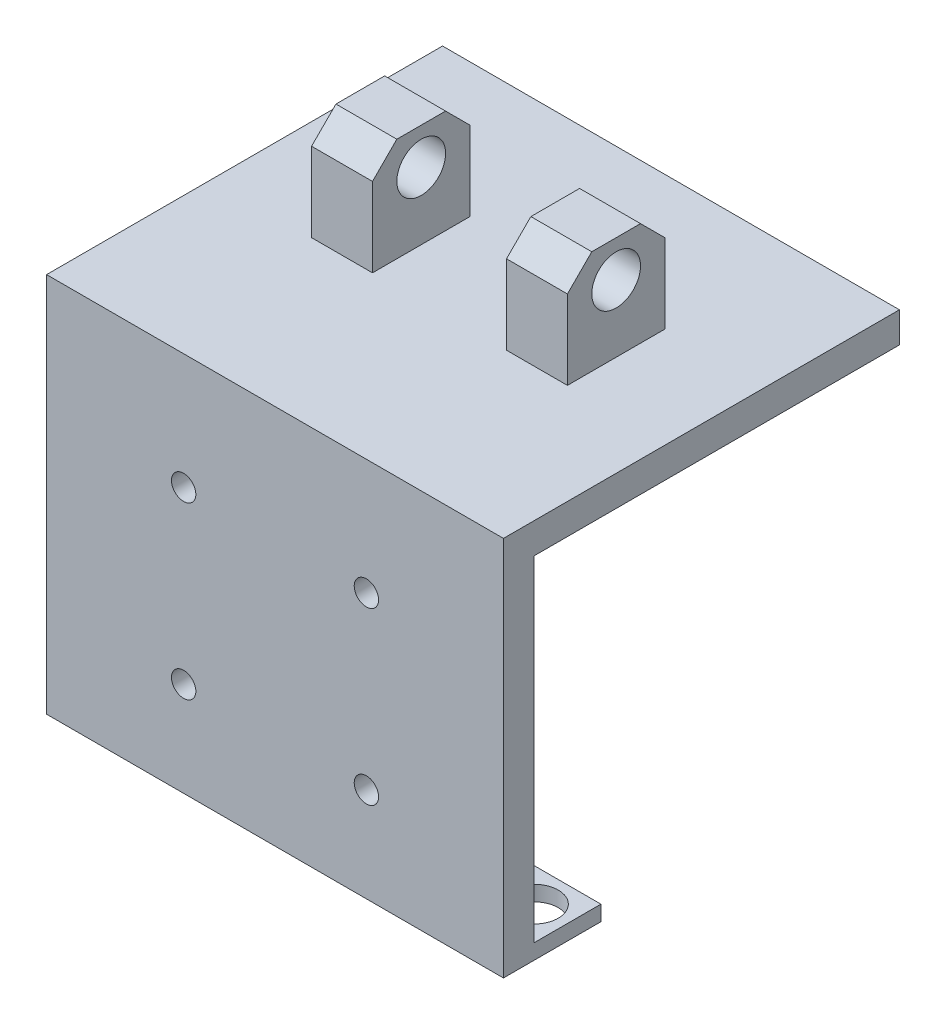
ISO-10303-21;
HEADER;
FILE_DESCRIPTION(('STEP AP214'),'2;1');
FILE_NAME('part.step','',(''),(''),'','','');
FILE_SCHEMA(('AUTOMOTIVE_DESIGN { 1 0 10303 214 1 1 1 1 }'));
ENDSEC;
DATA;
#1=APPLICATION_CONTEXT('core data for automotive mechanical design processes');
#2=APPLICATION_PROTOCOL_DEFINITION('international standard','automotive_design',2000,#1);
#3=PRODUCT_CONTEXT('',#1,'mechanical');
#4=PRODUCT('Part','Part','',(#3));
#5=PRODUCT_RELATED_PRODUCT_CATEGORY('part','',(#4));
#6=PRODUCT_DEFINITION_FORMATION('','',#4);
#7=PRODUCT_DEFINITION_CONTEXT('part definition',#1,'design');
#8=PRODUCT_DEFINITION('design','',#6,#7);
#9=PRODUCT_DEFINITION_SHAPE('','',#8);
#10=(LENGTH_UNIT() NAMED_UNIT(*) SI_UNIT(.MILLI.,.METRE.));
#11=(NAMED_UNIT(*) PLANE_ANGLE_UNIT() SI_UNIT($,.RADIAN.));
#12=(NAMED_UNIT(*) SI_UNIT($,.STERADIAN.) SOLID_ANGLE_UNIT());
#13=UNCERTAINTY_MEASURE_WITH_UNIT(LENGTH_MEASURE(1.E-05),#10,'distance_accuracy_value','');
#14=(GEOMETRIC_REPRESENTATION_CONTEXT(3) GLOBAL_UNCERTAINTY_ASSIGNED_CONTEXT((#13)) GLOBAL_UNIT_ASSIGNED_CONTEXT((#10,
#11,#12)) REPRESENTATION_CONTEXT('',''));
#15=CARTESIAN_POINT('',(0.,0.,0.));
#16=DIRECTION('',(0.,0.,1.));
#17=DIRECTION('',(1.,0.,0.));
#18=AXIS2_PLACEMENT_3D('',#15,#16,#17);
#19=CARTESIAN_POINT('',(-12.6888412017167,60.,1.56680469030455));
#20=DIRECTION('',(0.,0.,1.));
#21=DIRECTION('',(1.,0.,0.));
#22=AXIS2_PLACEMENT_3D('',#19,#20,#21);
#23=PLANE('',#22);
#24=CARTESIAN_POINT('',(9.81115879828327,13.,1.56680469030454));
#25=DIRECTION('',(0.,0.,-1.));
#26=DIRECTION('',(-1.,0.,0.));
#27=AXIS2_PLACEMENT_3D('',#24,#25,#26);
#28=CIRCLE('',#27,2.);
#29=CARTESIAN_POINT('',(7.81115879828327,13.,1.56680469030454));
#30=VERTEX_POINT('',#29);
#31=EDGE_CURVE('E273',#30,#30,#28,.T.);
#32=ORIENTED_EDGE('',*,*,#31,.F.);
#33=EDGE_LOOP('',(#32));
#34=FACE_BOUND('',#33,.T.);
#35=CARTESIAN_POINT('',(39.8111587982833,13.,1.56680469030454));
#36=DIRECTION('',(0.,0.,-1.));
#37=DIRECTION('',(-1.,0.,0.));
#38=AXIS2_PLACEMENT_3D('',#35,#36,#37);
#39=CIRCLE('',#38,2.);
#40=CARTESIAN_POINT('',(37.8111587982833,13.,1.56680469030454));
#41=VERTEX_POINT('',#40);
#42=EDGE_CURVE('E268',#41,#41,#39,.T.);
#43=ORIENTED_EDGE('',*,*,#42,.F.);
#44=EDGE_LOOP('',(#43));
#45=FACE_BOUND('',#44,.T.);
#46=CARTESIAN_POINT('',(39.8111587982833,41.,1.56680469030454));
#47=DIRECTION('',(0.,0.,-1.));
#48=DIRECTION('',(-1.,0.,0.));
#49=AXIS2_PLACEMENT_3D('',#46,#47,#48);
#50=CIRCLE('',#49,2.);
#51=CARTESIAN_POINT('',(37.8111587982833,41.,1.56680469030454));
#52=VERTEX_POINT('',#51);
#53=EDGE_CURVE('E262',#52,#52,#50,.T.);
#54=ORIENTED_EDGE('',*,*,#53,.F.);
#55=EDGE_LOOP('',(#54));
#56=FACE_BOUND('',#55,.T.);
#57=CARTESIAN_POINT('',(9.81115879828327,41.,1.56680469030454));
#58=DIRECTION('',(0.,0.,-1.));
#59=DIRECTION('',(-1.,0.,0.));
#60=AXIS2_PLACEMENT_3D('',#57,#58,#59);
#61=CIRCLE('',#60,2.);
#62=CARTESIAN_POINT('',(7.81115879828327,41.,1.56680469030454));
#63=VERTEX_POINT('',#62);
#64=EDGE_CURVE('E255',#63,#63,#61,.T.);
#65=ORIENTED_EDGE('',*,*,#64,.F.);
#66=EDGE_LOOP('',(#65));
#67=FACE_BOUND('',#66,.T.);
#68=DIRECTION('',(-1.,0.,0.));
#69=VECTOR('',#68,1.);
#70=CARTESIAN_POINT('',(-12.6888412017167,55.,1.56680469030455));
#71=LINE('',#70,#69);
#72=CARTESIAN_POINT('',(62.3111587982833,55.,1.56680469030453));
#73=VERTEX_POINT('',#72);
#74=CARTESIAN_POINT('',(-12.6888412017167,55.,1.56680469030455));
#75=VERTEX_POINT('',#74);
#76=EDGE_CURVE('E237',#73,#75,#71,.T.);
#77=ORIENTED_EDGE('',*,*,#76,.F.);
#78=DIRECTION('',(0.,-1.,0.));
#79=VECTOR('',#78,1.);
#80=CARTESIAN_POINT('',(62.3111587982833,60.,1.56680469030453));
#81=LINE('',#80,#79);
#82=CARTESIAN_POINT('',(62.3111587982833,0.,1.56680469030454));
#83=VERTEX_POINT('',#82);
#84=EDGE_CURVE('E291',#73,#83,#81,.T.);
#85=ORIENTED_EDGE('',*,*,#84,.T.);
#86=DIRECTION('',(-1.,0.,0.));
#87=VECTOR('',#86,1.);
#88=CARTESIAN_POINT('',(-12.6888412017167,0.,1.56680469030455));
#89=LINE('',#88,#87);
#90=CARTESIAN_POINT('',(-12.6888412017167,0.,1.56680469030455));
#91=VERTEX_POINT('',#90);
#92=EDGE_CURVE('E276',#83,#91,#89,.T.);
#93=ORIENTED_EDGE('',*,*,#92,.T.);
#94=DIRECTION('',(0.,-1.,0.));
#95=VECTOR('',#94,1.);
#96=CARTESIAN_POINT('',(-12.6888412017167,60.,1.56680469030455));
#97=LINE('',#96,#95);
#98=EDGE_CURVE('E287',#75,#91,#97,.T.);
#99=ORIENTED_EDGE('',*,*,#98,.F.);
#100=EDGE_LOOP('',(#77,#85,#93,#99));
#101=FACE_BOUND('',#100,.T.);
#102=ADVANCED_FACE('F35',(#34,#45,#56,#67,#101),#23,.F.);
#103=CARTESIAN_POINT('',(-12.6888412017167,-2.5,-9.43319530969545));
#104=DIRECTION('',(-1.,0.,0.));
#105=DIRECTION('',(0.,0.,1.));
#106=AXIS2_PLACEMENT_3D('',#103,#104,#105);
#107=PLANE('',#106);
#108=DIRECTION('',(0.,0.,1.));
#109=VECTOR('',#108,1.);
#110=CARTESIAN_POINT('',(-12.6888412017167,0.,-9.43319530969545));
#111=LINE('',#110,#109);
#112=CARTESIAN_POINT('',(-12.6888412017167,0.,-9.43319530969545));
#113=VERTEX_POINT('',#112);
#114=EDGE_CURVE('E303',#113,#91,#111,.T.);
#115=ORIENTED_EDGE('',*,*,#114,.F.);
#116=DIRECTION('',(0.,1.,0.));
#117=VECTOR('',#116,1.);
#118=CARTESIAN_POINT('',(-12.6888412017167,-2.5,-9.43319530969545));
#119=LINE('',#118,#117);
#120=CARTESIAN_POINT('',(-12.6888412017167,-2.5,-9.43319530969545));
#121=VERTEX_POINT('',#120);
#122=EDGE_CURVE('E326',#121,#113,#119,.T.);
#123=ORIENTED_EDGE('',*,*,#122,.F.);
#124=DIRECTION('',(0.,0.,1.));
#125=VECTOR('',#124,1.);
#126=CARTESIAN_POINT('',(-12.6888412017167,-2.5,-9.43319530969545));
#127=LINE('',#126,#125);
#128=CARTESIAN_POINT('',(-12.6888412017167,-2.5,6.56680469030455));
#129=VERTEX_POINT('',#128);
#130=EDGE_CURVE('E306',#121,#129,#127,.T.);
#131=ORIENTED_EDGE('',*,*,#130,.T.);
#132=DIRECTION('',(0.,1.,0.));
#133=VECTOR('',#132,1.);
#134=CARTESIAN_POINT('',(-12.6888412017167,-2.5,6.56680469030455));
#135=LINE('',#134,#133);
#136=CARTESIAN_POINT('',(-12.6888412017167,60.,6.56680469030455));
#137=VERTEX_POINT('',#136);
#138=EDGE_CURVE('E319',#129,#137,#135,.T.);
#139=ORIENTED_EDGE('',*,*,#138,.T.);
#140=DIRECTION('',(0.,0.,1.));
#141=VECTOR('',#140,1.);
#142=CARTESIAN_POINT('',(-12.6888412017167,60.,1.56680469030455));
#143=LINE('',#142,#141);
#144=CARTESIAN_POINT('',(-12.6888412017167,60.,-58.4331953096954));
#145=VERTEX_POINT('',#144);
#146=EDGE_CURVE('E279',#145,#137,#143,.T.);
#147=ORIENTED_EDGE('',*,*,#146,.F.);
#148=DIRECTION('',(0.,1.,0.));
#149=VECTOR('',#148,1.);
#150=CARTESIAN_POINT('',(-12.6888412017167,55.,-58.4331953096954));
#151=LINE('',#150,#149);
#152=CARTESIAN_POINT('',(-12.6888412017167,55.,-58.4331953096954));
#153=VERTEX_POINT('',#152);
#154=EDGE_CURVE('E238',#153,#145,#151,.T.);
#155=ORIENTED_EDGE('',*,*,#154,.F.);
#156=DIRECTION('',(0.,0.,1.));
#157=VECTOR('',#156,1.);
#158=CARTESIAN_POINT('',(-12.6888412017167,55.,-58.4331953096954));
#159=LINE('',#158,#157);
#160=EDGE_CURVE('E248',#153,#75,#159,.T.);
#161=ORIENTED_EDGE('',*,*,#160,.T.);
#162=ORIENTED_EDGE('',*,*,#98,.T.);
#163=EDGE_LOOP('',(#115,#123,#131,#139,#147,#155,#161,#162));
#164=FACE_BOUND('',#163,.T.);
#165=ADVANCED_FACE('F398',(#164),#107,.T.);
#166=CARTESIAN_POINT('',(-12.6888412017167,-2.5,-9.43319530969545));
#167=DIRECTION('',(0.,0.,-1.));
#168=DIRECTION('',(-1.,0.,0.));
#169=AXIS2_PLACEMENT_3D('',#166,#167,#168);
#170=PLANE('',#169);
#171=DIRECTION('',(-1.,0.,0.));
#172=VECTOR('',#171,1.);
#173=CARTESIAN_POINT('',(-12.6888412017167,0.,-9.43319530969545));
#174=LINE('',#173,#172);
#175=CARTESIAN_POINT('',(62.3111587982833,0.,-9.43319530969547));
#176=VERTEX_POINT('',#175);
#177=EDGE_CURVE('E310',#176,#113,#174,.T.);
#178=ORIENTED_EDGE('',*,*,#177,.F.);
#179=DIRECTION('',(0.,1.,0.));
#180=VECTOR('',#179,1.);
#181=CARTESIAN_POINT('',(62.3111587982833,-2.5,-9.43319530969547));
#182=LINE('',#181,#180);
#183=CARTESIAN_POINT('',(62.3111587982833,-2.5,-9.43319530969547));
#184=VERTEX_POINT('',#183);
#185=EDGE_CURVE('E329',#184,#176,#182,.T.);
#186=ORIENTED_EDGE('',*,*,#185,.F.);
#187=DIRECTION('',(-1.,0.,0.));
#188=VECTOR('',#187,1.);
#189=CARTESIAN_POINT('',(-12.6888412017167,-2.5,-9.43319530969545));
#190=LINE('',#189,#188);
#191=EDGE_CURVE('E316',#184,#121,#190,.T.);
#192=ORIENTED_EDGE('',*,*,#191,.T.);
#193=ORIENTED_EDGE('',*,*,#122,.T.);
#194=EDGE_LOOP('',(#178,#186,#192,#193));
#195=FACE_BOUND('',#194,.T.);
#196=ADVANCED_FACE('F404',(#195),#170,.T.);
#197=CARTESIAN_POINT('',(62.3111587982833,-2.5,-9.43319530969547));
#198=DIRECTION('',(1.,0.,0.));
#199=DIRECTION('',(0.,0.,-1.));
#200=AXIS2_PLACEMENT_3D('',#197,#198,#199);
#201=PLANE('',#200);
#202=DIRECTION('',(0.,0.,-1.));
#203=VECTOR('',#202,1.);
#204=CARTESIAN_POINT('',(62.3111587982833,0.,-9.43319530969547));
#205=LINE('',#204,#203);
#206=EDGE_CURVE('E322',#83,#176,#205,.T.);
#207=ORIENTED_EDGE('',*,*,#206,.F.);
#208=ORIENTED_EDGE('',*,*,#84,.F.);
#209=DIRECTION('',(0.,0.,1.));
#210=VECTOR('',#209,1.);
#211=CARTESIAN_POINT('',(62.3111587982833,55.,-58.4331953096955));
#212=LINE('',#211,#210);
#213=CARTESIAN_POINT('',(62.3111587982833,55.,-58.4331953096955));
#214=VERTEX_POINT('',#213);
#215=EDGE_CURVE('E252',#214,#73,#212,.T.);
#216=ORIENTED_EDGE('',*,*,#215,.F.);
#217=DIRECTION('',(0.,-1.,0.));
#218=VECTOR('',#217,1.);
#219=CARTESIAN_POINT('',(62.3111587982833,55.,-58.4331953096955));
#220=LINE('',#219,#218);
#221=CARTESIAN_POINT('',(62.3111587982833,60.,-58.4331953096955));
#222=VERTEX_POINT('',#221);
#223=EDGE_CURVE('E244',#222,#214,#220,.T.);
#224=ORIENTED_EDGE('',*,*,#223,.F.);
#225=DIRECTION('',(0.,0.,-1.));
#226=VECTOR('',#225,1.);
#227=CARTESIAN_POINT('',(62.3111587982833,60.,1.56680469030453));
#228=LINE('',#227,#226);
#229=CARTESIAN_POINT('',(62.3111587982833,60.,6.56680469030453));
#230=VERTEX_POINT('',#229);
#231=EDGE_CURVE('E285',#230,#222,#228,.T.);
#232=ORIENTED_EDGE('',*,*,#231,.F.);
#233=DIRECTION('',(0.,1.,0.));
#234=VECTOR('',#233,1.);
#235=CARTESIAN_POINT('',(62.3111587982833,-2.5,6.56680469030455));
#236=LINE('',#235,#234);
#237=CARTESIAN_POINT('',(62.3111587982833,-2.5,6.56680469030455));
#238=VERTEX_POINT('',#237);
#239=EDGE_CURVE('E332',#238,#230,#236,.T.);
#240=ORIENTED_EDGE('',*,*,#239,.F.);
#241=DIRECTION('',(0.,0.,-1.));
#242=VECTOR('',#241,1.);
#243=CARTESIAN_POINT('',(62.3111587982833,-2.5,-9.43319530969547));
#244=LINE('',#243,#242);
#245=EDGE_CURVE('E313',#238,#184,#244,.T.);
#246=ORIENTED_EDGE('',*,*,#245,.T.);
#247=ORIENTED_EDGE('',*,*,#185,.T.);
#248=EDGE_LOOP('',(#207,#208,#216,#224,#232,#240,#246,#247));
#249=FACE_BOUND('',#248,.T.);
#250=ADVANCED_FACE('F431',(#249),#201,.T.);
#251=CARTESIAN_POINT('',(-12.6888412017167,-2.5,6.56680469030455));
#252=DIRECTION('',(0.,0.,1.));
#253=DIRECTION('',(1.,0.,0.));
#254=AXIS2_PLACEMENT_3D('',#251,#252,#253);
#255=PLANE('',#254);
#256=CARTESIAN_POINT('',(9.81115879828327,41.,6.56680469030455));
#257=DIRECTION('',(0.,0.,1.));
#258=DIRECTION('',(1.,0.,0.));
#259=AXIS2_PLACEMENT_3D('',#256,#257,#258);
#260=CIRCLE('',#259,2.);
#261=CARTESIAN_POINT('',(11.8111587982833,41.,6.56680469030455));
#262=VERTEX_POINT('',#261);
#263=EDGE_CURVE('E259',#262,#262,#260,.F.);
#264=ORIENTED_EDGE('',*,*,#263,.T.);
#265=EDGE_LOOP('',(#264));
#266=FACE_BOUND('',#265,.T.);
#267=CARTESIAN_POINT('',(39.8111587982833,41.,6.56680469030455));
#268=DIRECTION('',(0.,0.,1.));
#269=DIRECTION('',(1.,0.,0.));
#270=AXIS2_PLACEMENT_3D('',#267,#268,#269);
#271=CIRCLE('',#270,2.);
#272=CARTESIAN_POINT('',(41.8111587982833,41.,6.56680469030455));
#273=VERTEX_POINT('',#272);
#274=EDGE_CURVE('E265',#273,#273,#271,.F.);
#275=ORIENTED_EDGE('',*,*,#274,.T.);
#276=EDGE_LOOP('',(#275));
#277=FACE_BOUND('',#276,.T.);
#278=CARTESIAN_POINT('',(39.8111587982833,13.,6.56680469030455));
#279=DIRECTION('',(0.,0.,1.));
#280=DIRECTION('',(1.,0.,0.));
#281=AXIS2_PLACEMENT_3D('',#278,#279,#280);
#282=CIRCLE('',#281,2.);
#283=CARTESIAN_POINT('',(41.8111587982833,13.,6.56680469030455));
#284=VERTEX_POINT('',#283);
#285=EDGE_CURVE('E254',#284,#284,#282,.F.);
#286=ORIENTED_EDGE('',*,*,#285,.T.);
#287=EDGE_LOOP('',(#286));
#288=FACE_BOUND('',#287,.T.);
#289=CARTESIAN_POINT('',(9.81115879828327,13.,6.56680469030455));
#290=DIRECTION('',(0.,0.,1.));
#291=DIRECTION('',(1.,0.,0.));
#292=AXIS2_PLACEMENT_3D('',#289,#290,#291);
#293=CIRCLE('',#292,2.);
#294=CARTESIAN_POINT('',(11.8111587982833,13.,6.56680469030455));
#295=VERTEX_POINT('',#294);
#296=EDGE_CURVE('E258',#295,#295,#293,.F.);
#297=ORIENTED_EDGE('',*,*,#296,.T.);
#298=EDGE_LOOP('',(#297));
#299=FACE_BOUND('',#298,.T.);
#300=ORIENTED_EDGE('',*,*,#239,.T.);
#301=DIRECTION('',(1.,0.,0.));
#302=VECTOR('',#301,1.);
#303=CARTESIAN_POINT('',(-12.6888412017167,60.,6.56680469030455));
#304=LINE('',#303,#302);
#305=EDGE_CURVE('E282',#137,#230,#304,.T.);
#306=ORIENTED_EDGE('',*,*,#305,.F.);
#307=ORIENTED_EDGE('',*,*,#138,.F.);
#308=DIRECTION('',(1.,0.,0.));
#309=VECTOR('',#308,1.);
#310=CARTESIAN_POINT('',(-12.6888412017167,-2.5,6.56680469030455));
#311=LINE('',#310,#309);
#312=EDGE_CURVE('E309',#129,#238,#311,.T.);
#313=ORIENTED_EDGE('',*,*,#312,.T.);
#314=EDGE_LOOP('',(#300,#306,#307,#313));
#315=FACE_BOUND('',#314,.T.);
#316=ADVANCED_FACE('F424',(#266,#277,#288,#299,#315),#255,.T.);
#317=CARTESIAN_POINT('',(0.,-2.5,0.));
#318=DIRECTION('',(0.,1.,0.));
#319=DIRECTION('',(0.,0.,1.));
#320=AXIS2_PLACEMENT_3D('',#317,#318,#319);
#321=PLANE('',#320);
#322=CARTESIAN_POINT('',(56.8111587982833,-2.5,-3.93319530969547));
#323=DIRECTION('',(0.,1.,0.));
#324=DIRECTION('',(0.,0.,1.));
#325=AXIS2_PLACEMENT_3D('',#322,#323,#324);
#326=CIRCLE('',#325,4.);
#327=CARTESIAN_POINT('',(56.8111587982833,-2.5,0.0668046903045298));
#328=VERTEX_POINT('',#327);
#329=EDGE_CURVE('E294',#328,#328,#326,.T.);
#330=ORIENTED_EDGE('',*,*,#329,.T.);
#331=EDGE_LOOP('',(#330));
#332=FACE_BOUND('',#331,.T.);
#333=CARTESIAN_POINT('',(-7.18884120171673,-2.5,-3.93319530969546));
#334=DIRECTION('',(0.,1.,0.));
#335=DIRECTION('',(0.,0.,1.));
#336=AXIS2_PLACEMENT_3D('',#333,#334,#335);
#337=CIRCLE('',#336,4.);
#338=CARTESIAN_POINT('',(-7.18884120171673,-2.5,0.0668046903045437));
#339=VERTEX_POINT('',#338);
#340=EDGE_CURVE('E300',#339,#339,#337,.T.);
#341=ORIENTED_EDGE('',*,*,#340,.T.);
#342=EDGE_LOOP('',(#341));
#343=FACE_BOUND('',#342,.T.);
#344=ORIENTED_EDGE('',*,*,#130,.F.);
#345=ORIENTED_EDGE('',*,*,#191,.F.);
#346=ORIENTED_EDGE('',*,*,#245,.F.);
#347=ORIENTED_EDGE('',*,*,#312,.F.);
#348=EDGE_LOOP('',(#344,#345,#346,#347));
#349=FACE_BOUND('',#348,.T.);
#350=ADVANCED_FACE('F421',(#332,#343,#349),#321,.F.);
#351=CARTESIAN_POINT('',(0.,0.,0.));
#352=DIRECTION('',(0.,1.,0.));
#353=DIRECTION('',(0.,0.,1.));
#354=AXIS2_PLACEMENT_3D('',#351,#352,#353);
#355=PLANE('',#354);
#356=ORIENTED_EDGE('',*,*,#92,.F.);
#357=ORIENTED_EDGE('',*,*,#206,.T.);
#358=ORIENTED_EDGE('',*,*,#177,.T.);
#359=ORIENTED_EDGE('',*,*,#114,.T.);
#360=EDGE_LOOP('',(#356,#357,#358,#359));
#361=FACE_BOUND('',#360,.T.);
#362=CARTESIAN_POINT('',(56.8111587982833,0.,-3.93319530969547));
#363=DIRECTION('',(0.,1.,0.));
#364=DIRECTION('',(0.,0.,1.));
#365=AXIS2_PLACEMENT_3D('',#362,#363,#364);
#366=CIRCLE('',#365,4.);
#367=CARTESIAN_POINT('',(56.8111587982833,0.,0.0668046903045298));
#368=VERTEX_POINT('',#367);
#369=EDGE_CURVE('E293',#368,#368,#366,.T.);
#370=ORIENTED_EDGE('',*,*,#369,.F.);
#371=EDGE_LOOP('',(#370));
#372=FACE_BOUND('',#371,.T.);
#373=CARTESIAN_POINT('',(-7.18884120171673,0.,-3.93319530969546));
#374=DIRECTION('',(0.,1.,0.));
#375=DIRECTION('',(0.,0.,1.));
#376=AXIS2_PLACEMENT_3D('',#373,#374,#375);
#377=CIRCLE('',#376,4.);
#378=CARTESIAN_POINT('',(-7.18884120171673,0.,0.0668046903045437));
#379=VERTEX_POINT('',#378);
#380=EDGE_CURVE('E297',#379,#379,#377,.T.);
#381=ORIENTED_EDGE('',*,*,#380,.F.);
#382=EDGE_LOOP('',(#381));
#383=FACE_BOUND('',#382,.T.);
#384=ADVANCED_FACE('F419',(#361,#372,#383),#355,.T.);
#385=CARTESIAN_POINT('',(-7.18884120171673,-2.5,-3.93319530969546));
#386=DIRECTION('',(0.,1.,0.));
#387=DIRECTION('',(0.,0.,1.));
#388=AXIS2_PLACEMENT_3D('',#385,#386,#387);
#389=CYLINDRICAL_SURFACE('',#388,4.);
#390=ORIENTED_EDGE('',*,*,#340,.F.);
#391=EDGE_LOOP('',(#390));
#392=FACE_BOUND('',#391,.T.);
#393=ORIENTED_EDGE('',*,*,#380,.T.);
#394=EDGE_LOOP('',(#393));
#395=FACE_BOUND('',#394,.T.);
#396=ADVANCED_FACE('F415',(#392,#395),#389,.F.);
#397=CARTESIAN_POINT('',(56.8111587982833,-2.5,-3.93319530969547));
#398=DIRECTION('',(0.,1.,0.));
#399=DIRECTION('',(0.,0.,1.));
#400=AXIS2_PLACEMENT_3D('',#397,#398,#399);
#401=CYLINDRICAL_SURFACE('',#400,4.);
#402=ORIENTED_EDGE('',*,*,#329,.F.);
#403=EDGE_LOOP('',(#402));
#404=FACE_BOUND('',#403,.T.);
#405=ORIENTED_EDGE('',*,*,#369,.T.);
#406=EDGE_LOOP('',(#405));
#407=FACE_BOUND('',#406,.T.);
#408=ADVANCED_FACE('F412',(#404,#407),#401,.F.);
#409=CARTESIAN_POINT('',(0.,60.,0.));
#410=DIRECTION('',(0.,1.,0.));
#411=DIRECTION('',(0.,0.,1.));
#412=AXIS2_PLACEMENT_3D('',#409,#410,#411);
#413=PLANE('',#412);
#414=DIRECTION('',(0.,0.,-1.));
#415=VECTOR('',#414,1.);
#416=CARTESIAN_POINT('',(13.8111587982833,60.,0.));
#417=LINE('',#416,#415);
#418=CARTESIAN_POINT('',(13.8111587982833,60.,-20.4331953096954));
#419=VERTEX_POINT('',#418);
#420=CARTESIAN_POINT('',(13.8111587982833,60.,-36.4331953096954));
#421=VERTEX_POINT('',#420);
#422=EDGE_CURVE('E180',#419,#421,#417,.T.);
#423=ORIENTED_EDGE('',*,*,#422,.F.);
#424=DIRECTION('',(1.,0.,0.));
#425=VECTOR('',#424,1.);
#426=CARTESIAN_POINT('',(0.,60.,-20.4331953096954));
#427=LINE('',#426,#425);
#428=CARTESIAN_POINT('',(3.81115879828327,60.,-20.4331953096954));
#429=VERTEX_POINT('',#428);
#430=EDGE_CURVE('E196',#429,#419,#427,.T.);
#431=ORIENTED_EDGE('',*,*,#430,.F.);
#432=DIRECTION('',(0.,0.,1.));
#433=VECTOR('',#432,1.);
#434=CARTESIAN_POINT('',(3.81115879828327,60.,0.));
#435=LINE('',#434,#433);
#436=CARTESIAN_POINT('',(3.81115879828328,60.,-36.4331953096954));
#437=VERTEX_POINT('',#436);
#438=EDGE_CURVE('E204',#437,#429,#435,.T.);
#439=ORIENTED_EDGE('',*,*,#438,.F.);
#440=DIRECTION('',(-1.,0.,0.));
#441=VECTOR('',#440,1.);
#442=CARTESIAN_POINT('',(0.,60.,-36.4331953096954));
#443=LINE('',#442,#441);
#444=EDGE_CURVE('E199',#421,#437,#443,.T.);
#445=ORIENTED_EDGE('',*,*,#444,.F.);
#446=EDGE_LOOP('',(#423,#431,#439,#445));
#447=FACE_BOUND('',#446,.T.);
#448=DIRECTION('',(1.,0.,0.));
#449=VECTOR('',#448,1.);
#450=CARTESIAN_POINT('',(0.,60.,-20.4331953096955));
#451=LINE('',#450,#449);
#452=CARTESIAN_POINT('',(35.8111587982833,60.,-20.4331953096954));
#453=VERTEX_POINT('',#452);
#454=CARTESIAN_POINT('',(45.8111587982833,60.,-20.4331953096954));
#455=VERTEX_POINT('',#454);
#456=EDGE_CURVE('E234',#453,#455,#451,.T.);
#457=ORIENTED_EDGE('',*,*,#456,.F.);
#458=DIRECTION('',(0.,0.,1.));
#459=VECTOR('',#458,1.);
#460=CARTESIAN_POINT('',(35.8111587982833,60.,0.));
#461=LINE('',#460,#459);
#462=CARTESIAN_POINT('',(35.8111587982833,60.,-36.4331953096954));
#463=VERTEX_POINT('',#462);
#464=EDGE_CURVE('E220',#463,#453,#461,.T.);
#465=ORIENTED_EDGE('',*,*,#464,.F.);
#466=DIRECTION('',(-1.,0.,0.));
#467=VECTOR('',#466,1.);
#468=CARTESIAN_POINT('',(0.,60.,-36.4331953096954));
#469=LINE('',#468,#467);
#470=CARTESIAN_POINT('',(45.8111587982833,60.,-36.4331953096954));
#471=VERTEX_POINT('',#470);
#472=EDGE_CURVE('E228',#471,#463,#469,.T.);
#473=ORIENTED_EDGE('',*,*,#472,.F.);
#474=DIRECTION('',(0.,0.,-1.));
#475=VECTOR('',#474,1.);
#476=CARTESIAN_POINT('',(45.8111587982833,60.,0.));
#477=LINE('',#476,#475);
#478=EDGE_CURVE('E231',#455,#471,#477,.T.);
#479=ORIENTED_EDGE('',*,*,#478,.F.);
#480=EDGE_LOOP('',(#457,#465,#473,#479));
#481=FACE_BOUND('',#480,.T.);
#482=ORIENTED_EDGE('',*,*,#146,.T.);
#483=ORIENTED_EDGE('',*,*,#305,.T.);
#484=ORIENTED_EDGE('',*,*,#231,.T.);
#485=DIRECTION('',(1.,0.,0.));
#486=VECTOR('',#485,1.);
#487=CARTESIAN_POINT('',(-12.6888412017167,60.,-58.4331953096954));
#488=LINE('',#487,#486);
#489=EDGE_CURVE('E241',#145,#222,#488,.T.);
#490=ORIENTED_EDGE('',*,*,#489,.F.);
#491=EDGE_LOOP('',(#482,#483,#484,#490));
#492=FACE_BOUND('',#491,.T.);
#493=ADVANCED_FACE('F193',(#447,#481,#492),#413,.T.);
#494=CARTESIAN_POINT('',(9.81115879828327,13.,6.56780469030456));
#495=DIRECTION('',(0.,0.,-1.));
#496=DIRECTION('',(-1.,0.,0.));
#497=AXIS2_PLACEMENT_3D('',#494,#495,#496);
#498=CYLINDRICAL_SURFACE('',#497,2.);
#499=ORIENTED_EDGE('',*,*,#296,.F.);
#500=EDGE_LOOP('',(#499));
#501=FACE_BOUND('',#500,.T.);
#502=ORIENTED_EDGE('',*,*,#31,.T.);
#503=EDGE_LOOP('',(#502));
#504=FACE_BOUND('',#503,.T.);
#505=ADVANCED_FACE('F492',(#501,#504),#498,.F.);
#506=CARTESIAN_POINT('',(39.8111587982833,13.,6.56780469030455));
#507=DIRECTION('',(0.,0.,-1.));
#508=DIRECTION('',(-1.,0.,0.));
#509=AXIS2_PLACEMENT_3D('',#506,#507,#508);
#510=CYLINDRICAL_SURFACE('',#509,2.);
#511=ORIENTED_EDGE('',*,*,#285,.F.);
#512=EDGE_LOOP('',(#511));
#513=FACE_BOUND('',#512,.T.);
#514=ORIENTED_EDGE('',*,*,#42,.T.);
#515=EDGE_LOOP('',(#514));
#516=FACE_BOUND('',#515,.T.);
#517=ADVANCED_FACE('F489',(#513,#516),#510,.F.);
#518=CARTESIAN_POINT('',(39.8111587982833,41.,6.56780469030455));
#519=DIRECTION('',(0.,0.,-1.));
#520=DIRECTION('',(-1.,0.,0.));
#521=AXIS2_PLACEMENT_3D('',#518,#519,#520);
#522=CYLINDRICAL_SURFACE('',#521,2.);
#523=ORIENTED_EDGE('',*,*,#274,.F.);
#524=EDGE_LOOP('',(#523));
#525=FACE_BOUND('',#524,.T.);
#526=ORIENTED_EDGE('',*,*,#53,.T.);
#527=EDGE_LOOP('',(#526));
#528=FACE_BOUND('',#527,.T.);
#529=ADVANCED_FACE('F482',(#525,#528),#522,.F.);
#530=CARTESIAN_POINT('',(9.81115879828327,41.,6.56780469030456));
#531=DIRECTION('',(0.,0.,-1.));
#532=DIRECTION('',(-1.,0.,0.));
#533=AXIS2_PLACEMENT_3D('',#530,#531,#532);
#534=CYLINDRICAL_SURFACE('',#533,2.);
#535=ORIENTED_EDGE('',*,*,#263,.F.);
#536=EDGE_LOOP('',(#535));
#537=FACE_BOUND('',#536,.T.);
#538=ORIENTED_EDGE('',*,*,#64,.T.);
#539=EDGE_LOOP('',(#538));
#540=FACE_BOUND('',#539,.T.);
#541=ADVANCED_FACE('F475',(#537,#540),#534,.F.);
#542=CARTESIAN_POINT('',(-12.6888412017167,55.,-58.4331953096954));
#543=DIRECTION('',(0.,1.,0.));
#544=DIRECTION('',(-1.,0.,0.));
#545=AXIS2_PLACEMENT_3D('',#542,#543,#544);
#546=PLANE('',#545);
#547=ORIENTED_EDGE('',*,*,#76,.T.);
#548=ORIENTED_EDGE('',*,*,#160,.F.);
#549=DIRECTION('',(-1.,0.,0.));
#550=VECTOR('',#549,1.);
#551=CARTESIAN_POINT('',(-12.6888412017167,55.,-58.4331953096954));
#552=LINE('',#551,#550);
#553=EDGE_CURVE('E246',#214,#153,#552,.T.);
#554=ORIENTED_EDGE('',*,*,#553,.F.);
#555=ORIENTED_EDGE('',*,*,#215,.T.);
#556=EDGE_LOOP('',(#547,#548,#554,#555));
#557=FACE_BOUND('',#556,.T.);
#558=ADVANCED_FACE('F473',(#557),#546,.F.);
#559=CARTESIAN_POINT('',(0.,0.,-58.4331953096955));
#560=DIRECTION('',(0.,0.,-1.));
#561=DIRECTION('',(-1.,0.,0.));
#562=AXIS2_PLACEMENT_3D('',#559,#560,#561);
#563=PLANE('',#562);
#564=ORIENTED_EDGE('',*,*,#154,.T.);
#565=ORIENTED_EDGE('',*,*,#489,.T.);
#566=ORIENTED_EDGE('',*,*,#223,.T.);
#567=ORIENTED_EDGE('',*,*,#553,.T.);
#568=EDGE_LOOP('',(#564,#565,#566,#567));
#569=FACE_BOUND('',#568,.T.);
#570=ADVANCED_FACE('F459',(#569),#563,.T.);
#571=CARTESIAN_POINT('',(35.8111587982833,77.,-20.4331953096954));
#572=DIRECTION('',(0.,0.,1.));
#573=DIRECTION('',(1.,0.,0.));
#574=AXIS2_PLACEMENT_3D('',#571,#572,#573);
#575=PLANE('',#574);
#576=DIRECTION('',(0.,-1.,0.));
#577=VECTOR('',#576,1.);
#578=CARTESIAN_POINT('',(45.8111587982833,77.,-20.4331953096954));
#579=LINE('',#578,#577);
#580=CARTESIAN_POINT('',(45.8111587982833,73.,-20.4331953096954));
#581=VERTEX_POINT('',#580);
#582=EDGE_CURVE('E218',#581,#455,#579,.T.);
#583=ORIENTED_EDGE('',*,*,#582,.F.);
#584=DIRECTION('',(-1.,0.,0.));
#585=VECTOR('',#584,1.);
#586=CARTESIAN_POINT('',(35.8111587982833,73.,-20.4331953096954));
#587=LINE('',#586,#585);
#588=CARTESIAN_POINT('',(35.8111587982833,73.,-20.4331953096954));
#589=VERTEX_POINT('',#588);
#590=EDGE_CURVE('E351',#581,#589,#587,.T.);
#591=ORIENTED_EDGE('',*,*,#590,.T.);
#592=DIRECTION('',(0.,-1.,0.));
#593=VECTOR('',#592,1.);
#594=CARTESIAN_POINT('',(35.8111587982833,77.,-20.4331953096954));
#595=LINE('',#594,#593);
#596=EDGE_CURVE('E217',#589,#453,#595,.T.);
#597=ORIENTED_EDGE('',*,*,#596,.T.);
#598=ORIENTED_EDGE('',*,*,#456,.T.);
#599=EDGE_LOOP('',(#583,#591,#597,#598));
#600=FACE_BOUND('',#599,.T.);
#601=ADVANCED_FACE('F377',(#600),#575,.T.);
#602=CARTESIAN_POINT('',(45.8111587982833,77.,-20.4331953096954));
#603=DIRECTION('',(1.,0.,0.));
#604=DIRECTION('',(0.,0.,-1.));
#605=AXIS2_PLACEMENT_3D('',#602,#603,#604);
#606=PLANE('',#605);
#607=CARTESIAN_POINT('',(45.8111587982833,71.,-28.4331953096954));
#608=DIRECTION('',(1.,0.,0.));
#609=DIRECTION('',(0.,0.,-1.));
#610=AXIS2_PLACEMENT_3D('',#607,#608,#609);
#611=CIRCLE('',#610,4.00000000000001);
#612=CARTESIAN_POINT('',(45.8111587982833,71.,-32.4331953096954));
#613=VERTEX_POINT('',#612);
#614=EDGE_CURVE('E667',#613,#613,#611,.T.);
#615=ORIENTED_EDGE('',*,*,#614,.F.);
#616=EDGE_LOOP('',(#615));
#617=FACE_BOUND('',#616,.T.);
#618=DIRECTION('',(0.,0.,1.));
#619=VECTOR('',#618,1.);
#620=CARTESIAN_POINT('',(45.8111587982833,77.,-20.4331953096954));
#621=LINE('',#620,#619);
#622=CARTESIAN_POINT('',(45.8111587982833,77.,-32.4331953096954));
#623=VERTEX_POINT('',#622);
#624=CARTESIAN_POINT('',(45.8111587982833,77.,-24.4331953096954));
#625=VERTEX_POINT('',#624);
#626=EDGE_CURVE('E215',#623,#625,#621,.T.);
#627=ORIENTED_EDGE('',*,*,#626,.T.);
#628=DIRECTION('',(0.,0.707106781186548,-0.707106781186547));
#629=VECTOR('',#628,1.);
#630=CARTESIAN_POINT('',(45.8111587982833,75.,-22.4331953096954));
#631=LINE('',#630,#629);
#632=EDGE_CURVE('E362',#625,#581,#631,.F.);
#633=ORIENTED_EDGE('',*,*,#632,.T.);
#634=ORIENTED_EDGE('',*,*,#582,.T.);
#635=ORIENTED_EDGE('',*,*,#478,.T.);
#636=DIRECTION('',(0.,-1.,0.));
#637=VECTOR('',#636,1.);
#638=CARTESIAN_POINT('',(45.8111587982833,77.,-36.4331953096954));
#639=LINE('',#638,#637);
#640=CARTESIAN_POINT('',(45.8111587982833,73.,-36.4331953096954));
#641=VERTEX_POINT('',#640);
#642=EDGE_CURVE('E221',#641,#471,#639,.T.);
#643=ORIENTED_EDGE('',*,*,#642,.F.);
#644=DIRECTION('',(0.,-0.707106781186546,-0.707106781186549));
#645=VECTOR('',#644,1.);
#646=CARTESIAN_POINT('',(45.8111587982833,83.,-26.4331953096954));
#647=LINE('',#646,#645);
#648=EDGE_CURVE('E50',#641,#623,#647,.F.);
#649=ORIENTED_EDGE('',*,*,#648,.T.);
#650=EDGE_LOOP('',(#627,#633,#634,#635,#643,#649));
#651=FACE_BOUND('',#650,.T.);
#652=ADVANCED_FACE('F370',(#617,#651),#606,.T.);
#653=CARTESIAN_POINT('',(45.8111587982833,77.,-36.4331953096954));
#654=DIRECTION('',(0.,0.,-1.));
#655=DIRECTION('',(0.,1.,0.));
#656=AXIS2_PLACEMENT_3D('',#653,#654,#655);
#657=PLANE('',#656);
#658=DIRECTION('',(0.,-1.,0.));
#659=VECTOR('',#658,1.);
#660=CARTESIAN_POINT('',(35.8111587982833,77.,-36.4331953096954));
#661=LINE('',#660,#659);
#662=CARTESIAN_POINT('',(35.8111587982833,73.,-36.4331953096954));
#663=VERTEX_POINT('',#662);
#664=EDGE_CURVE('E223',#663,#463,#661,.T.);
#665=ORIENTED_EDGE('',*,*,#664,.F.);
#666=DIRECTION('',(1.,0.,0.));
#667=VECTOR('',#666,1.);
#668=CARTESIAN_POINT('',(45.8111587982833,73.,-36.4331953096954));
#669=LINE('',#668,#667);
#670=EDGE_CURVE('E43',#663,#641,#669,.T.);
#671=ORIENTED_EDGE('',*,*,#670,.T.);
#672=ORIENTED_EDGE('',*,*,#642,.T.);
#673=ORIENTED_EDGE('',*,*,#472,.T.);
#674=EDGE_LOOP('',(#665,#671,#672,#673));
#675=FACE_BOUND('',#674,.T.);
#676=ADVANCED_FACE('F366',(#675),#657,.T.);
#677=CARTESIAN_POINT('',(35.8111587982833,77.,-20.4331953096954));
#678=DIRECTION('',(-1.,0.,0.));
#679=DIRECTION('',(0.,0.,1.));
#680=AXIS2_PLACEMENT_3D('',#677,#678,#679);
#681=PLANE('',#680);
#682=CARTESIAN_POINT('',(35.8111587982833,71.,-28.4331953096954));
#683=DIRECTION('',(-1.,0.,0.));
#684=DIRECTION('',(0.,0.,1.));
#685=AXIS2_PLACEMENT_3D('',#682,#683,#684);
#686=CIRCLE('',#685,4.00000000000001);
#687=CARTESIAN_POINT('',(35.8111587982833,71.,-24.4331953096954));
#688=VERTEX_POINT('',#687);
#689=EDGE_CURVE('E670',#688,#688,#686,.T.);
#690=ORIENTED_EDGE('',*,*,#689,.F.);
#691=EDGE_LOOP('',(#690));
#692=FACE_BOUND('',#691,.T.);
#693=ORIENTED_EDGE('',*,*,#596,.F.);
#694=DIRECTION('',(0.,-0.707106781186548,0.707106781186547));
#695=VECTOR('',#694,1.);
#696=CARTESIAN_POINT('',(35.8111587982833,75.,-22.4331953096954));
#697=LINE('',#696,#695);
#698=CARTESIAN_POINT('',(35.8111587982833,77.,-24.4331953096954));
#699=VERTEX_POINT('',#698);
#700=EDGE_CURVE('E356',#589,#699,#697,.F.);
#701=ORIENTED_EDGE('',*,*,#700,.T.);
#702=DIRECTION('',(0.,0.,-1.));
#703=VECTOR('',#702,1.);
#704=CARTESIAN_POINT('',(35.8111587982833,77.,-20.4331953096954));
#705=LINE('',#704,#703);
#706=CARTESIAN_POINT('',(35.8111587982833,77.,-32.4331953096954));
#707=VERTEX_POINT('',#706);
#708=EDGE_CURVE('E200',#699,#707,#705,.T.);
#709=ORIENTED_EDGE('',*,*,#708,.T.);
#710=DIRECTION('',(0.,0.707106781186546,0.707106781186549));
#711=VECTOR('',#710,1.);
#712=CARTESIAN_POINT('',(35.8111587982833,83.,-26.4331953096954));
#713=LINE('',#712,#711);
#714=EDGE_CURVE('E354',#707,#663,#713,.F.);
#715=ORIENTED_EDGE('',*,*,#714,.T.);
#716=ORIENTED_EDGE('',*,*,#664,.T.);
#717=ORIENTED_EDGE('',*,*,#464,.T.);
#718=EDGE_LOOP('',(#693,#701,#709,#715,#716,#717));
#719=FACE_BOUND('',#718,.T.);
#720=ADVANCED_FACE('F381',(#692,#719),#681,.T.);
#721=CARTESIAN_POINT('',(0.,77.,0.));
#722=DIRECTION('',(0.,1.,0.));
#723=DIRECTION('',(-1.,0.,0.));
#724=AXIS2_PLACEMENT_3D('',#721,#722,#723);
#725=PLANE('',#724);
#726=ORIENTED_EDGE('',*,*,#708,.F.);
#727=DIRECTION('',(1.,0.,0.));
#728=VECTOR('',#727,1.);
#729=CARTESIAN_POINT('',(0.,77.,-24.4331953096955));
#730=LINE('',#729,#728);
#731=EDGE_CURVE('E58',#699,#625,#730,.T.);
#732=ORIENTED_EDGE('',*,*,#731,.T.);
#733=ORIENTED_EDGE('',*,*,#626,.F.);
#734=DIRECTION('',(-1.,0.,0.));
#735=VECTOR('',#734,1.);
#736=CARTESIAN_POINT('',(0.,77.,-32.4331953096954));
#737=LINE('',#736,#735);
#738=EDGE_CURVE('E358',#623,#707,#737,.T.);
#739=ORIENTED_EDGE('',*,*,#738,.T.);
#740=EDGE_LOOP('',(#726,#732,#733,#739));
#741=FACE_BOUND('',#740,.T.);
#742=ADVANCED_FACE('F383',(#741),#725,.T.);
#743=CARTESIAN_POINT('',(13.8111587982833,77.,-20.4331953096954));
#744=DIRECTION('',(1.,0.,0.));
#745=DIRECTION('',(0.,0.,-1.));
#746=AXIS2_PLACEMENT_3D('',#743,#744,#745);
#747=PLANE('',#746);
#748=CARTESIAN_POINT('',(13.8111587982833,71.,-28.4331953096955));
#749=DIRECTION('',(1.,0.,0.));
#750=DIRECTION('',(0.,0.,-1.));
#751=AXIS2_PLACEMENT_3D('',#748,#749,#750);
#752=CIRCLE('',#751,4.00000000000001);
#753=CARTESIAN_POINT('',(13.8111587982833,71.,-32.4331953096955));
#754=VERTEX_POINT('',#753);
#755=EDGE_CURVE('E338',#754,#754,#752,.T.);
#756=ORIENTED_EDGE('',*,*,#755,.F.);
#757=EDGE_LOOP('',(#756));
#758=FACE_BOUND('',#757,.T.);
#759=DIRECTION('',(0.,0.,1.));
#760=VECTOR('',#759,1.);
#761=CARTESIAN_POINT('',(13.8111587982833,77.,-20.4331953096954));
#762=LINE('',#761,#760);
#763=CARTESIAN_POINT('',(13.8111587982833,77.,-32.4331953096954));
#764=VERTEX_POINT('',#763);
#765=CARTESIAN_POINT('',(13.8111587982833,77.,-24.4331953096955));
#766=VERTEX_POINT('',#765);
#767=EDGE_CURVE('E665',#764,#766,#762,.T.);
#768=ORIENTED_EDGE('',*,*,#767,.T.);
#769=DIRECTION('',(0.,0.707106781186547,-0.707106781186548));
#770=VECTOR('',#769,1.);
#771=CARTESIAN_POINT('',(13.8111587982833,75.,-22.4331953096955));
#772=LINE('',#771,#770);
#773=CARTESIAN_POINT('',(13.8111587982833,73.,-20.4331953096954));
#774=VERTEX_POINT('',#773);
#775=EDGE_CURVE('E182',#766,#774,#772,.F.);
#776=ORIENTED_EDGE('',*,*,#775,.T.);
#777=DIRECTION('',(0.,-1.,0.));
#778=VECTOR('',#777,1.);
#779=CARTESIAN_POINT('',(13.8111587982833,77.,-20.4331953096954));
#780=LINE('',#779,#778);
#781=EDGE_CURVE('E175',#774,#419,#780,.T.);
#782=ORIENTED_EDGE('',*,*,#781,.T.);
#783=ORIENTED_EDGE('',*,*,#422,.T.);
#784=DIRECTION('',(0.,-1.,0.));
#785=VECTOR('',#784,1.);
#786=CARTESIAN_POINT('',(13.8111587982833,77.,-36.4331953096954));
#787=LINE('',#786,#785);
#788=CARTESIAN_POINT('',(13.8111587982833,73.,-36.4331953096954));
#789=VERTEX_POINT('',#788);
#790=EDGE_CURVE('E205',#789,#421,#787,.T.);
#791=ORIENTED_EDGE('',*,*,#790,.F.);
#792=DIRECTION('',(0.,-0.707106781186545,-0.70710678118655));
#793=VECTOR('',#792,1.);
#794=CARTESIAN_POINT('',(13.8111587982833,83.,-26.4331953096954));
#795=LINE('',#794,#793);
#796=EDGE_CURVE('E348',#789,#764,#795,.F.);
#797=ORIENTED_EDGE('',*,*,#796,.T.);
#798=EDGE_LOOP('',(#768,#776,#782,#783,#791,#797));
#799=FACE_BOUND('',#798,.T.);
#800=ADVANCED_FACE('F178',(#758,#799),#747,.T.);
#801=CARTESIAN_POINT('',(13.8111587982833,77.,-36.4331953096954));
#802=DIRECTION('',(0.,0.,-1.));
#803=DIRECTION('',(0.,1.,0.));
#804=AXIS2_PLACEMENT_3D('',#801,#802,#803);
#805=PLANE('',#804);
#806=DIRECTION('',(0.,-1.,0.));
#807=VECTOR('',#806,1.);
#808=CARTESIAN_POINT('',(3.81115879828328,77.,-36.4331953096954));
#809=LINE('',#808,#807);
#810=CARTESIAN_POINT('',(3.81115879828328,73.,-36.4331953096954));
#811=VERTEX_POINT('',#810);
#812=EDGE_CURVE('E208',#811,#437,#809,.T.);
#813=ORIENTED_EDGE('',*,*,#812,.F.);
#814=DIRECTION('',(1.,0.,0.));
#815=VECTOR('',#814,1.);
#816=CARTESIAN_POINT('',(13.8111587982833,73.,-36.4331953096954));
#817=LINE('',#816,#815);
#818=EDGE_CURVE('E11',#811,#789,#817,.T.);
#819=ORIENTED_EDGE('',*,*,#818,.T.);
#820=ORIENTED_EDGE('',*,*,#790,.T.);
#821=ORIENTED_EDGE('',*,*,#444,.T.);
#822=EDGE_LOOP('',(#813,#819,#820,#821));
#823=FACE_BOUND('',#822,.T.);
#824=ADVANCED_FACE('F585',(#823),#805,.T.);
#825=CARTESIAN_POINT('',(3.81115879828328,77.,-20.4331953096954));
#826=DIRECTION('',(-1.,0.,0.));
#827=DIRECTION('',(0.,-1.,0.));
#828=AXIS2_PLACEMENT_3D('',#825,#826,#827);
#829=PLANE('',#828);
#830=CARTESIAN_POINT('',(3.81115879828329,71.,-28.4331953096955));
#831=DIRECTION('',(-1.,0.,0.));
#832=DIRECTION('',(0.,-1.,0.));
#833=AXIS2_PLACEMENT_3D('',#830,#831,#832);
#834=CIRCLE('',#833,4.00000000000001);
#835=CARTESIAN_POINT('',(3.81115879828328,67.,-28.4331953096955));
#836=VERTEX_POINT('',#835);
#837=EDGE_CURVE('E335',#836,#836,#834,.T.);
#838=ORIENTED_EDGE('',*,*,#837,.F.);
#839=EDGE_LOOP('',(#838));
#840=FACE_BOUND('',#839,.T.);
#841=DIRECTION('',(0.,-1.,0.));
#842=VECTOR('',#841,1.);
#843=CARTESIAN_POINT('',(3.81115879828328,77.,-20.4331953096954));
#844=LINE('',#843,#842);
#845=CARTESIAN_POINT('',(3.81115879828328,73.,-20.4331953096954));
#846=VERTEX_POINT('',#845);
#847=EDGE_CURVE('E187',#846,#429,#844,.T.);
#848=ORIENTED_EDGE('',*,*,#847,.F.);
#849=DIRECTION('',(0.,-0.707106781186547,0.707106781186548));
#850=VECTOR('',#849,1.);
#851=CARTESIAN_POINT('',(3.81115879828328,75.,-22.4331953096955));
#852=LINE('',#851,#850);
#853=CARTESIAN_POINT('',(3.81115879828328,77.,-24.4331953096955));
#854=VERTEX_POINT('',#853);
#855=EDGE_CURVE('E342',#846,#854,#852,.F.);
#856=ORIENTED_EDGE('',*,*,#855,.T.);
#857=DIRECTION('',(0.,0.,-1.));
#858=VECTOR('',#857,1.);
#859=CARTESIAN_POINT('',(3.81115879828328,77.,-20.4331953096954));
#860=LINE('',#859,#858);
#861=CARTESIAN_POINT('',(3.81115879828328,77.,-32.4331953096954));
#862=VERTEX_POINT('',#861);
#863=EDGE_CURVE('E188',#854,#862,#860,.T.);
#864=ORIENTED_EDGE('',*,*,#863,.T.);
#865=DIRECTION('',(0.,0.707106781186545,0.70710678118655));
#866=VECTOR('',#865,1.);
#867=CARTESIAN_POINT('',(3.81115879828328,83.,-26.4331953096954));
#868=LINE('',#867,#866);
#869=EDGE_CURVE('E340',#862,#811,#868,.F.);
#870=ORIENTED_EDGE('',*,*,#869,.T.);
#871=ORIENTED_EDGE('',*,*,#812,.T.);
#872=ORIENTED_EDGE('',*,*,#438,.T.);
#873=EDGE_LOOP('',(#848,#856,#864,#870,#871,#872));
#874=FACE_BOUND('',#873,.T.);
#875=ADVANCED_FACE('F593',(#840,#874),#829,.T.);
#876=CARTESIAN_POINT('',(13.8111587982833,77.,-20.4331953096954));
#877=DIRECTION('',(0.,0.,1.));
#878=DIRECTION('',(1.,0.,0.));
#879=AXIS2_PLACEMENT_3D('',#876,#877,#878);
#880=PLANE('',#879);
#881=ORIENTED_EDGE('',*,*,#781,.F.);
#882=DIRECTION('',(-1.,0.,0.));
#883=VECTOR('',#882,1.);
#884=CARTESIAN_POINT('',(13.8111587982833,73.,-20.4331953096954));
#885=LINE('',#884,#883);
#886=EDGE_CURVE('E328',#774,#846,#885,.T.);
#887=ORIENTED_EDGE('',*,*,#886,.T.);
#888=ORIENTED_EDGE('',*,*,#847,.T.);
#889=ORIENTED_EDGE('',*,*,#430,.T.);
#890=EDGE_LOOP('',(#881,#887,#888,#889));
#891=FACE_BOUND('',#890,.T.);
#892=ADVANCED_FACE('F202',(#891),#880,.T.);
#893=CARTESIAN_POINT('',(0.,77.,0.));
#894=DIRECTION('',(0.,1.,0.));
#895=DIRECTION('',(-1.,0.,0.));
#896=AXIS2_PLACEMENT_3D('',#893,#894,#895);
#897=PLANE('',#896);
#898=ORIENTED_EDGE('',*,*,#863,.F.);
#899=DIRECTION('',(1.,0.,0.));
#900=VECTOR('',#899,1.);
#901=CARTESIAN_POINT('',(0.,77.,-24.4331953096955));
#902=LINE('',#901,#900);
#903=EDGE_CURVE('E346',#854,#766,#902,.T.);
#904=ORIENTED_EDGE('',*,*,#903,.T.);
#905=ORIENTED_EDGE('',*,*,#767,.F.);
#906=DIRECTION('',(-1.,0.,0.));
#907=VECTOR('',#906,1.);
#908=CARTESIAN_POINT('',(0.,77.,-32.4331953096954));
#909=LINE('',#908,#907);
#910=EDGE_CURVE('E344',#764,#862,#909,.T.);
#911=ORIENTED_EDGE('',*,*,#910,.T.);
#912=EDGE_LOOP('',(#898,#904,#905,#911));
#913=FACE_BOUND('',#912,.T.);
#914=ADVANCED_FACE('F608',(#913),#897,.T.);
#915=CARTESIAN_POINT('',(-12.6888412017168,71.,-28.4331953096955));
#916=DIRECTION('',(1.,0.,0.));
#917=DIRECTION('',(0.,0.,-1.));
#918=AXIS2_PLACEMENT_3D('',#915,#916,#917);
#919=CYLINDRICAL_SURFACE('',#918,4.00000000000001);
#920=ORIENTED_EDGE('',*,*,#755,.T.);
#921=EDGE_LOOP('',(#920));
#922=FACE_BOUND('',#921,.T.);
#923=ORIENTED_EDGE('',*,*,#837,.T.);
#924=EDGE_LOOP('',(#923));
#925=FACE_BOUND('',#924,.T.);
#926=ADVANCED_FACE('F615',(#922,#925),#919,.F.);
#927=ORIENTED_EDGE('',*,*,#614,.T.);
#928=EDGE_LOOP('',(#927));
#929=FACE_BOUND('',#928,.T.);
#930=ORIENTED_EDGE('',*,*,#689,.T.);
#931=EDGE_LOOP('',(#930));
#932=FACE_BOUND('',#931,.T.);
#933=ADVANCED_FACE('F394',(#929,#932),#919,.F.);
#934=CARTESIAN_POINT('',(13.8111587982833,73.,-20.4331953096954));
#935=DIRECTION('',(0.,-0.707106781186548,-0.707106781186547));
#936=DIRECTION('',(-1.,0.,0.));
#937=AXIS2_PLACEMENT_3D('',#934,#935,#936);
#938=PLANE('',#937);
#939=ORIENTED_EDGE('',*,*,#775,.F.);
#940=ORIENTED_EDGE('',*,*,#903,.F.);
#941=ORIENTED_EDGE('',*,*,#855,.F.);
#942=ORIENTED_EDGE('',*,*,#886,.F.);
#943=EDGE_LOOP('',(#939,#940,#941,#942));
#944=FACE_BOUND('',#943,.T.);
#945=ADVANCED_FACE('F388',(#944),#938,.F.);
#946=CARTESIAN_POINT('',(35.8111587982833,73.,-20.4331953096954));
#947=DIRECTION('',(0.,-0.707106781186547,-0.707106781186548));
#948=DIRECTION('',(-1.,0.,0.));
#949=AXIS2_PLACEMENT_3D('',#946,#947,#948);
#950=PLANE('',#949);
#951=ORIENTED_EDGE('',*,*,#632,.F.);
#952=ORIENTED_EDGE('',*,*,#731,.F.);
#953=ORIENTED_EDGE('',*,*,#700,.F.);
#954=ORIENTED_EDGE('',*,*,#590,.F.);
#955=EDGE_LOOP('',(#951,#952,#953,#954));
#956=FACE_BOUND('',#955,.T.);
#957=ADVANCED_FACE('F386',(#956),#950,.F.);
#958=CARTESIAN_POINT('',(45.8111587982833,73.,-36.4331953096954));
#959=DIRECTION('',(0.,-0.707106781186549,0.707106781186546));
#960=DIRECTION('',(1.,0.,0.));
#961=AXIS2_PLACEMENT_3D('',#958,#959,#960);
#962=PLANE('',#961);
#963=ORIENTED_EDGE('',*,*,#714,.F.);
#964=ORIENTED_EDGE('',*,*,#738,.F.);
#965=ORIENTED_EDGE('',*,*,#648,.F.);
#966=ORIENTED_EDGE('',*,*,#670,.F.);
#967=EDGE_LOOP('',(#963,#964,#965,#966));
#968=FACE_BOUND('',#967,.T.);
#969=ADVANCED_FACE('F382',(#968),#962,.F.);
#970=CARTESIAN_POINT('',(13.8111587982833,73.,-36.4331953096954));
#971=DIRECTION('',(0.,-0.70710678118655,0.707106781186545));
#972=DIRECTION('',(1.,0.,0.));
#973=AXIS2_PLACEMENT_3D('',#970,#971,#972);
#974=PLANE('',#973);
#975=ORIENTED_EDGE('',*,*,#869,.F.);
#976=ORIENTED_EDGE('',*,*,#910,.F.);
#977=ORIENTED_EDGE('',*,*,#796,.F.);
#978=ORIENTED_EDGE('',*,*,#818,.F.);
#979=EDGE_LOOP('',(#975,#976,#977,#978));
#980=FACE_BOUND('',#979,.T.);
#981=ADVANCED_FACE('F37',(#980),#974,.F.);
#982=CLOSED_SHELL('',(#102,#165,#196,#250,#316,#350,#384,#396,#408,#493,#505,#517,#529,#541,
#558,#570,#601,#652,#676,#720,#742,#800,#824,#875,#892,#914,#926,#933,#945,#957,#969,#981));
#983=MANIFOLD_SOLID_BREP('B2',#982);
#984=ADVANCED_BREP_SHAPE_REPRESENTATION('',(#18,#983),#14);
#985=SHAPE_DEFINITION_REPRESENTATION(#9,#984);
ENDSEC;
END-ISO-10303-21;
